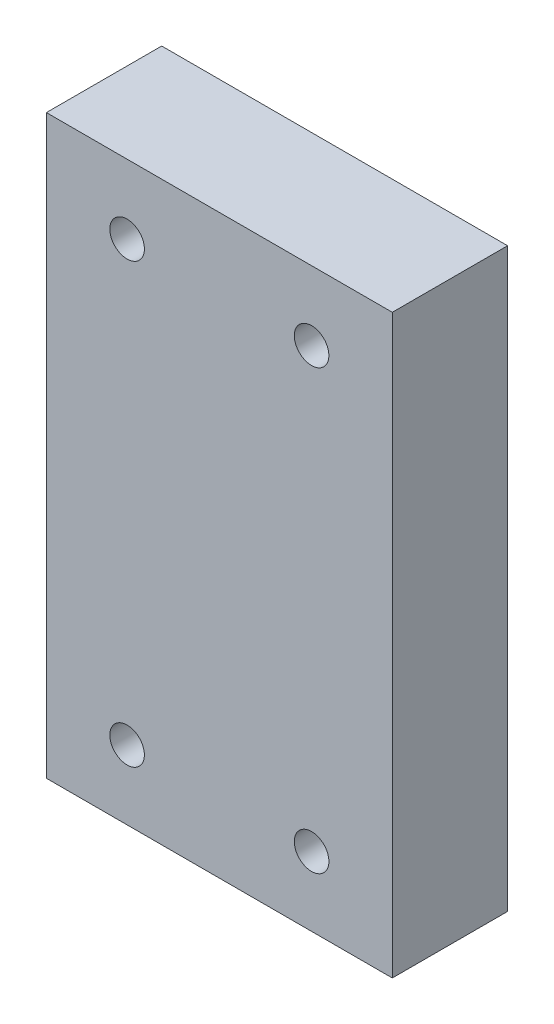
ISO-10303-21;
HEADER;
FILE_DESCRIPTION(('STEP AP214'),'2;1');
FILE_NAME('part.step','',(''),(''),'','','');
FILE_SCHEMA(('AUTOMOTIVE_DESIGN { 1 0 10303 214 1 1 1 1 }'));
ENDSEC;
DATA;
#1=APPLICATION_CONTEXT('core data for automotive mechanical design processes');
#2=APPLICATION_PROTOCOL_DEFINITION('international standard','automotive_design',2000,#1);
#3=PRODUCT_CONTEXT('',#1,'mechanical');
#4=PRODUCT('Part','Part','',(#3));
#5=PRODUCT_RELATED_PRODUCT_CATEGORY('part','',(#4));
#6=PRODUCT_DEFINITION_FORMATION('','',#4);
#7=PRODUCT_DEFINITION_CONTEXT('part definition',#1,'design');
#8=PRODUCT_DEFINITION('design','',#6,#7);
#9=PRODUCT_DEFINITION_SHAPE('','',#8);
#10=(LENGTH_UNIT() NAMED_UNIT(*) SI_UNIT(.MILLI.,.METRE.));
#11=(NAMED_UNIT(*) PLANE_ANGLE_UNIT() SI_UNIT($,.RADIAN.));
#12=(NAMED_UNIT(*) SI_UNIT($,.STERADIAN.) SOLID_ANGLE_UNIT());
#13=UNCERTAINTY_MEASURE_WITH_UNIT(LENGTH_MEASURE(1.E-05),#10,'distance_accuracy_value','');
#14=(GEOMETRIC_REPRESENTATION_CONTEXT(3) GLOBAL_UNCERTAINTY_ASSIGNED_CONTEXT((#13)) GLOBAL_UNIT_ASSIGNED_CONTEXT((#10,
#11,#12)) REPRESENTATION_CONTEXT('',''));
#15=CARTESIAN_POINT('',(0.,0.,0.));
#16=DIRECTION('',(0.,0.,1.));
#17=DIRECTION('',(1.,0.,0.));
#18=AXIS2_PLACEMENT_3D('',#15,#16,#17);
#19=CARTESIAN_POINT('',(0.,0.,10.));
#20=DIRECTION('',(0.,0.,1.));
#21=DIRECTION('',(1.,0.,0.));
#22=AXIS2_PLACEMENT_3D('',#19,#20,#21);
#23=PLANE('',#22);
#24=CARTESIAN_POINT('',(8.,-19.,10.));
#25=DIRECTION('',(0.,0.,1.));
#26=DIRECTION('',(1.,0.,0.));
#27=AXIS2_PLACEMENT_3D('',#24,#25,#26);
#28=CIRCLE('',#27,1.5);
#29=CARTESIAN_POINT('',(9.5,-19.,10.));
#30=VERTEX_POINT('',#29);
#31=EDGE_CURVE('E135',#30,#30,#28,.T.);
#32=ORIENTED_EDGE('',*,*,#31,.F.);
#33=EDGE_LOOP('',(#32));
#34=FACE_BOUND('',#33,.T.);
#35=CARTESIAN_POINT('',(-8.,19.,10.));
#36=DIRECTION('',(0.,0.,1.));
#37=DIRECTION('',(1.,0.,0.));
#38=AXIS2_PLACEMENT_3D('',#35,#36,#37);
#39=CIRCLE('',#38,1.5);
#40=CARTESIAN_POINT('',(-6.5,19.,10.));
#41=VERTEX_POINT('',#40);
#42=EDGE_CURVE('E114',#41,#41,#39,.T.);
#43=ORIENTED_EDGE('',*,*,#42,.F.);
#44=EDGE_LOOP('',(#43));
#45=FACE_BOUND('',#44,.T.);
#46=DIRECTION('',(0.,-1.,0.));
#47=VECTOR('',#46,1.);
#48=CARTESIAN_POINT('',(-15.,-25.,10.));
#49=LINE('',#48,#47);
#50=CARTESIAN_POINT('',(-15.,25.,10.));
#51=VERTEX_POINT('',#50);
#52=CARTESIAN_POINT('',(-15.,-25.,10.));
#53=VERTEX_POINT('',#52);
#54=EDGE_CURVE('E99',#51,#53,#49,.T.);
#55=ORIENTED_EDGE('',*,*,#54,.T.);
#56=DIRECTION('',(1.,0.,0.));
#57=VECTOR('',#56,1.);
#58=CARTESIAN_POINT('',(15.,-25.,10.));
#59=LINE('',#58,#57);
#60=CARTESIAN_POINT('',(15.,-25.,10.));
#61=VERTEX_POINT('',#60);
#62=EDGE_CURVE('E94',#53,#61,#59,.T.);
#63=ORIENTED_EDGE('',*,*,#62,.T.);
#64=DIRECTION('',(0.,1.,0.));
#65=VECTOR('',#64,1.);
#66=CARTESIAN_POINT('',(15.,-25.,10.));
#67=LINE('',#66,#65);
#68=CARTESIAN_POINT('',(15.,25.,10.));
#69=VERTEX_POINT('',#68);
#70=EDGE_CURVE('E97',#61,#69,#67,.T.);
#71=ORIENTED_EDGE('',*,*,#70,.T.);
#72=DIRECTION('',(-1.,0.,0.));
#73=VECTOR('',#72,1.);
#74=CARTESIAN_POINT('',(15.,25.,10.));
#75=LINE('',#74,#73);
#76=EDGE_CURVE('E64',#69,#51,#75,.T.);
#77=ORIENTED_EDGE('',*,*,#76,.T.);
#78=EDGE_LOOP('',(#55,#63,#71,#77));
#79=FACE_BOUND('',#78,.T.);
#80=CARTESIAN_POINT('',(8.,19.,10.));
#81=DIRECTION('',(0.,0.,1.));
#82=DIRECTION('',(-1.,0.,0.));
#83=AXIS2_PLACEMENT_3D('',#80,#81,#82);
#84=CIRCLE('',#83,1.5);
#85=CARTESIAN_POINT('',(6.5,19.,10.));
#86=VERTEX_POINT('',#85);
#87=EDGE_CURVE('E129',#86,#86,#84,.T.);
#88=ORIENTED_EDGE('',*,*,#87,.F.);
#89=EDGE_LOOP('',(#88));
#90=FACE_BOUND('',#89,.T.);
#91=CARTESIAN_POINT('',(-8.,-19.,10.));
#92=DIRECTION('',(0.,0.,1.));
#93=DIRECTION('',(-1.,0.,0.));
#94=AXIS2_PLACEMENT_3D('',#91,#92,#93);
#95=CIRCLE('',#94,1.5);
#96=CARTESIAN_POINT('',(-9.5,-19.,10.));
#97=VERTEX_POINT('',#96);
#98=EDGE_CURVE('E141',#97,#97,#95,.T.);
#99=ORIENTED_EDGE('',*,*,#98,.F.);
#100=EDGE_LOOP('',(#99));
#101=FACE_BOUND('',#100,.T.);
#102=ADVANCED_FACE('F47',(#34,#45,#79,#90,#101),#23,.T.);
#103=CARTESIAN_POINT('',(0.,0.,0.));
#104=DIRECTION('',(0.,0.,1.));
#105=DIRECTION('',(1.,0.,0.));
#106=AXIS2_PLACEMENT_3D('',#103,#104,#105);
#107=PLANE('',#106);
#108=DIRECTION('',(0.,-1.,0.));
#109=VECTOR('',#108,1.);
#110=CARTESIAN_POINT('',(-15.,-25.,0.));
#111=LINE('',#110,#109);
#112=CARTESIAN_POINT('',(-15.,25.,0.));
#113=VERTEX_POINT('',#112);
#114=CARTESIAN_POINT('',(-15.,-25.,0.));
#115=VERTEX_POINT('',#114);
#116=EDGE_CURVE('E111',#113,#115,#111,.T.);
#117=ORIENTED_EDGE('',*,*,#116,.F.);
#118=DIRECTION('',(-1.,0.,0.));
#119=VECTOR('',#118,1.);
#120=CARTESIAN_POINT('',(15.,25.,0.));
#121=LINE('',#120,#119);
#122=CARTESIAN_POINT('',(15.,25.,0.));
#123=VERTEX_POINT('',#122);
#124=EDGE_CURVE('E87',#123,#113,#121,.T.);
#125=ORIENTED_EDGE('',*,*,#124,.F.);
#126=DIRECTION('',(0.,1.,0.));
#127=VECTOR('',#126,1.);
#128=CARTESIAN_POINT('',(15.,-25.,0.));
#129=LINE('',#128,#127);
#130=CARTESIAN_POINT('',(15.,-25.,0.));
#131=VERTEX_POINT('',#130);
#132=EDGE_CURVE('E81',#131,#123,#129,.T.);
#133=ORIENTED_EDGE('',*,*,#132,.F.);
#134=DIRECTION('',(1.,0.,0.));
#135=VECTOR('',#134,1.);
#136=CARTESIAN_POINT('',(15.,-25.,0.));
#137=LINE('',#136,#135);
#138=EDGE_CURVE('E103',#115,#131,#137,.T.);
#139=ORIENTED_EDGE('',*,*,#138,.F.);
#140=EDGE_LOOP('',(#117,#125,#133,#139));
#141=FACE_BOUND('',#140,.T.);
#142=CARTESIAN_POINT('',(-8.,19.,0.));
#143=DIRECTION('',(0.,0.,1.));
#144=DIRECTION('',(1.,0.,0.));
#145=AXIS2_PLACEMENT_3D('',#142,#143,#144);
#146=CIRCLE('',#145,1.5);
#147=CARTESIAN_POINT('',(-6.5,19.,0.));
#148=VERTEX_POINT('',#147);
#149=EDGE_CURVE('E126',#148,#148,#146,.T.);
#150=ORIENTED_EDGE('',*,*,#149,.T.);
#151=EDGE_LOOP('',(#150));
#152=FACE_BOUND('',#151,.T.);
#153=CARTESIAN_POINT('',(8.,19.,0.));
#154=DIRECTION('',(0.,0.,1.));
#155=DIRECTION('',(-1.,0.,0.));
#156=AXIS2_PLACEMENT_3D('',#153,#154,#155);
#157=CIRCLE('',#156,1.5);
#158=CARTESIAN_POINT('',(6.5,19.,0.));
#159=VERTEX_POINT('',#158);
#160=EDGE_CURVE('E132',#159,#159,#157,.T.);
#161=ORIENTED_EDGE('',*,*,#160,.T.);
#162=EDGE_LOOP('',(#161));
#163=FACE_BOUND('',#162,.T.);
#164=CARTESIAN_POINT('',(8.,-19.,0.));
#165=DIRECTION('',(0.,0.,1.));
#166=DIRECTION('',(1.,0.,0.));
#167=AXIS2_PLACEMENT_3D('',#164,#165,#166);
#168=CIRCLE('',#167,1.5);
#169=CARTESIAN_POINT('',(9.5,-19.,0.));
#170=VERTEX_POINT('',#169);
#171=EDGE_CURVE('E138',#170,#170,#168,.T.);
#172=ORIENTED_EDGE('',*,*,#171,.T.);
#173=EDGE_LOOP('',(#172));
#174=FACE_BOUND('',#173,.T.);
#175=CARTESIAN_POINT('',(-8.,-19.,0.));
#176=DIRECTION('',(0.,0.,1.));
#177=DIRECTION('',(-1.,0.,0.));
#178=AXIS2_PLACEMENT_3D('',#175,#176,#177);
#179=CIRCLE('',#178,1.5);
#180=CARTESIAN_POINT('',(-9.5,-19.,0.));
#181=VERTEX_POINT('',#180);
#182=EDGE_CURVE('E144',#181,#181,#179,.T.);
#183=ORIENTED_EDGE('',*,*,#182,.T.);
#184=EDGE_LOOP('',(#183));
#185=FACE_BOUND('',#184,.T.);
#186=ADVANCED_FACE('F122',(#141,#152,#163,#174,#185),#107,.F.);
#187=CARTESIAN_POINT('',(-15.,-25.,10.));
#188=DIRECTION('',(1.,0.,0.));
#189=DIRECTION('',(0.,1.,0.));
#190=AXIS2_PLACEMENT_3D('',#187,#188,#189);
#191=PLANE('',#190);
#192=CARTESIAN_POINT('',(-15.,12.5,5.));
#193=DIRECTION('',(-1.,0.,0.));
#194=DIRECTION('',(0.,-1.,0.));
#195=AXIS2_PLACEMENT_3D('',#192,#193,#194);
#196=CIRCLE('',#195,2.);
#197=CARTESIAN_POINT('',(-15.,10.5,5.));
#198=VERTEX_POINT('',#197);
#199=EDGE_CURVE('E156',#198,#198,#196,.T.);
#200=ORIENTED_EDGE('',*,*,#199,.F.);
#201=EDGE_LOOP('',(#200));
#202=FACE_BOUND('',#201,.T.);
#203=CARTESIAN_POINT('',(-15.,-12.5,5.00000000000001));
#204=DIRECTION('',(-1.,0.,0.));
#205=DIRECTION('',(0.,1.,0.));
#206=AXIS2_PLACEMENT_3D('',#203,#204,#205);
#207=CIRCLE('',#206,2.);
#208=CARTESIAN_POINT('',(-15.,-10.5,5.00000000000001));
#209=VERTEX_POINT('',#208);
#210=EDGE_CURVE('E150',#209,#209,#207,.T.);
#211=ORIENTED_EDGE('',*,*,#210,.F.);
#212=EDGE_LOOP('',(#211));
#213=FACE_BOUND('',#212,.T.);
#214=ORIENTED_EDGE('',*,*,#116,.T.);
#215=DIRECTION('',(0.,0.,-1.));
#216=VECTOR('',#215,1.);
#217=CARTESIAN_POINT('',(-15.,-25.,10.));
#218=LINE('',#217,#216);
#219=EDGE_CURVE('E13',#53,#115,#218,.T.);
#220=ORIENTED_EDGE('',*,*,#219,.F.);
#221=ORIENTED_EDGE('',*,*,#54,.F.);
#222=DIRECTION('',(0.,0.,-1.));
#223=VECTOR('',#222,1.);
#224=CARTESIAN_POINT('',(-15.,25.,10.));
#225=LINE('',#224,#223);
#226=EDGE_CURVE('E107',#51,#113,#225,.T.);
#227=ORIENTED_EDGE('',*,*,#226,.T.);
#228=EDGE_LOOP('',(#214,#220,#221,#227));
#229=FACE_BOUND('',#228,.T.);
#230=ADVANCED_FACE('F49',(#202,#213,#229),#191,.F.);
#231=CARTESIAN_POINT('',(15.,-25.,10.));
#232=DIRECTION('',(0.,1.,0.));
#233=DIRECTION('',(-1.,0.,0.));
#234=AXIS2_PLACEMENT_3D('',#231,#232,#233);
#235=PLANE('',#234);
#236=ORIENTED_EDGE('',*,*,#138,.T.);
#237=DIRECTION('',(0.,0.,-1.));
#238=VECTOR('',#237,1.);
#239=CARTESIAN_POINT('',(15.,-25.,10.));
#240=LINE('',#239,#238);
#241=EDGE_CURVE('E56',#61,#131,#240,.T.);
#242=ORIENTED_EDGE('',*,*,#241,.F.);
#243=ORIENTED_EDGE('',*,*,#62,.F.);
#244=ORIENTED_EDGE('',*,*,#219,.T.);
#245=EDGE_LOOP('',(#236,#242,#243,#244));
#246=FACE_BOUND('',#245,.T.);
#247=ADVANCED_FACE('F102',(#246),#235,.F.);
#248=CARTESIAN_POINT('',(15.,-25.,10.));
#249=DIRECTION('',(-1.,0.,0.));
#250=DIRECTION('',(0.,0.,1.));
#251=AXIS2_PLACEMENT_3D('',#248,#249,#250);
#252=PLANE('',#251);
#253=ORIENTED_EDGE('',*,*,#132,.T.);
#254=DIRECTION('',(0.,0.,-1.));
#255=VECTOR('',#254,1.);
#256=CARTESIAN_POINT('',(15.,25.,10.));
#257=LINE('',#256,#255);
#258=EDGE_CURVE('E104',#69,#123,#257,.T.);
#259=ORIENTED_EDGE('',*,*,#258,.F.);
#260=ORIENTED_EDGE('',*,*,#70,.F.);
#261=ORIENTED_EDGE('',*,*,#241,.T.);
#262=EDGE_LOOP('',(#253,#259,#260,#261));
#263=FACE_BOUND('',#262,.T.);
#264=ADVANCED_FACE('F105',(#263),#252,.F.);
#265=CARTESIAN_POINT('',(15.,25.,10.));
#266=DIRECTION('',(0.,-1.,0.));
#267=DIRECTION('',(1.,0.,0.));
#268=AXIS2_PLACEMENT_3D('',#265,#266,#267);
#269=PLANE('',#268);
#270=ORIENTED_EDGE('',*,*,#124,.T.);
#271=ORIENTED_EDGE('',*,*,#226,.F.);
#272=ORIENTED_EDGE('',*,*,#76,.F.);
#273=ORIENTED_EDGE('',*,*,#258,.T.);
#274=EDGE_LOOP('',(#270,#271,#272,#273));
#275=FACE_BOUND('',#274,.T.);
#276=ADVANCED_FACE('F119',(#275),#269,.F.);
#277=CARTESIAN_POINT('',(-8.,19.,10.));
#278=DIRECTION('',(0.,0.,-1.));
#279=DIRECTION('',(-1.,0.,0.));
#280=AXIS2_PLACEMENT_3D('',#277,#278,#279);
#281=CYLINDRICAL_SURFACE('',#280,1.5);
#282=ORIENTED_EDGE('',*,*,#42,.T.);
#283=EDGE_LOOP('',(#282));
#284=FACE_BOUND('',#283,.T.);
#285=ORIENTED_EDGE('',*,*,#149,.F.);
#286=EDGE_LOOP('',(#285));
#287=FACE_BOUND('',#286,.T.);
#288=ADVANCED_FACE('F200',(#284,#287),#281,.F.);
#289=CARTESIAN_POINT('',(8.,19.,10.));
#290=DIRECTION('',(0.,0.,-1.));
#291=DIRECTION('',(-1.,0.,0.));
#292=AXIS2_PLACEMENT_3D('',#289,#290,#291);
#293=CYLINDRICAL_SURFACE('',#292,1.5);
#294=ORIENTED_EDGE('',*,*,#87,.T.);
#295=EDGE_LOOP('',(#294));
#296=FACE_BOUND('',#295,.T.);
#297=ORIENTED_EDGE('',*,*,#160,.F.);
#298=EDGE_LOOP('',(#297));
#299=FACE_BOUND('',#298,.T.);
#300=ADVANCED_FACE('F226',(#296,#299),#293,.F.);
#301=CARTESIAN_POINT('',(8.,-19.,10.));
#302=DIRECTION('',(0.,0.,-1.));
#303=DIRECTION('',(-1.,0.,0.));
#304=AXIS2_PLACEMENT_3D('',#301,#302,#303);
#305=CYLINDRICAL_SURFACE('',#304,1.5);
#306=ORIENTED_EDGE('',*,*,#31,.T.);
#307=EDGE_LOOP('',(#306));
#308=FACE_BOUND('',#307,.T.);
#309=ORIENTED_EDGE('',*,*,#171,.F.);
#310=EDGE_LOOP('',(#309));
#311=FACE_BOUND('',#310,.T.);
#312=ADVANCED_FACE('F186',(#308,#311),#305,.F.);
#313=CARTESIAN_POINT('',(-8.,-19.,10.));
#314=DIRECTION('',(0.,0.,-1.));
#315=DIRECTION('',(-1.,0.,0.));
#316=AXIS2_PLACEMENT_3D('',#313,#314,#315);
#317=CYLINDRICAL_SURFACE('',#316,1.5);
#318=ORIENTED_EDGE('',*,*,#98,.T.);
#319=EDGE_LOOP('',(#318));
#320=FACE_BOUND('',#319,.T.);
#321=ORIENTED_EDGE('',*,*,#182,.F.);
#322=EDGE_LOOP('',(#321));
#323=FACE_BOUND('',#322,.T.);
#324=ADVANCED_FACE('F177',(#320,#323),#317,.F.);
#325=CARTESIAN_POINT('',(-5.,-12.5,5.00000000000001));
#326=DIRECTION('',(-1.,0.,0.));
#327=DIRECTION('',(0.,-1.,0.));
#328=AXIS2_PLACEMENT_3D('',#325,#326,#327);
#329=CYLINDRICAL_SURFACE('',#328,2.);
#330=CARTESIAN_POINT('',(-5.,-12.5,5.00000000000001));
#331=DIRECTION('',(-1.,0.,0.));
#332=DIRECTION('',(0.,1.,0.));
#333=AXIS2_PLACEMENT_3D('',#330,#331,#332);
#334=CIRCLE('',#333,2.);
#335=CARTESIAN_POINT('',(-5.,-10.5,5.00000000000001));
#336=VERTEX_POINT('',#335);
#337=EDGE_CURVE('E153',#336,#336,#334,.T.);
#338=ORIENTED_EDGE('',*,*,#337,.F.);
#339=EDGE_LOOP('',(#338));
#340=FACE_BOUND('',#339,.T.);
#341=ORIENTED_EDGE('',*,*,#210,.T.);
#342=EDGE_LOOP('',(#341));
#343=FACE_BOUND('',#342,.T.);
#344=ADVANCED_FACE('F175',(#340,#343),#329,.F.);
#345=CARTESIAN_POINT('',(-5.,-12.5,5.00000000000001));
#346=DIRECTION('',(1.,0.,0.));
#347=DIRECTION('',(0.,1.,0.));
#348=AXIS2_PLACEMENT_3D('',#345,#346,#347);
#349=PLANE('',#348);
#350=ORIENTED_EDGE('',*,*,#337,.T.);
#351=EDGE_LOOP('',(#350));
#352=FACE_BOUND('',#351,.T.);
#353=ADVANCED_FACE('F167',(#352),#349,.F.);
#354=CARTESIAN_POINT('',(-5.,12.5,5.));
#355=DIRECTION('',(-1.,0.,0.));
#356=DIRECTION('',(0.,-1.,0.));
#357=AXIS2_PLACEMENT_3D('',#354,#355,#356);
#358=CYLINDRICAL_SURFACE('',#357,2.);
#359=CARTESIAN_POINT('',(-5.,12.5,5.));
#360=DIRECTION('',(-1.,0.,0.));
#361=DIRECTION('',(0.,-1.,0.));
#362=AXIS2_PLACEMENT_3D('',#359,#360,#361);
#363=CIRCLE('',#362,2.);
#364=CARTESIAN_POINT('',(-5.,10.5,5.));
#365=VERTEX_POINT('',#364);
#366=EDGE_CURVE('E147',#365,#365,#363,.T.);
#367=ORIENTED_EDGE('',*,*,#366,.F.);
#368=EDGE_LOOP('',(#367));
#369=FACE_BOUND('',#368,.T.);
#370=ORIENTED_EDGE('',*,*,#199,.T.);
#371=EDGE_LOOP('',(#370));
#372=FACE_BOUND('',#371,.T.);
#373=ADVANCED_FACE('F164',(#369,#372),#358,.F.);
#374=CARTESIAN_POINT('',(-5.,12.5,5.));
#375=DIRECTION('',(-1.,0.,0.));
#376=DIRECTION('',(0.,-1.,0.));
#377=AXIS2_PLACEMENT_3D('',#374,#375,#376);
#378=PLANE('',#377);
#379=ORIENTED_EDGE('',*,*,#366,.T.);
#380=EDGE_LOOP('',(#379));
#381=FACE_BOUND('',#380,.T.);
#382=ADVANCED_FACE('F162',(#381),#378,.T.);
#383=CLOSED_SHELL('',(#102,#186,#230,#247,#264,#276,#288,#300,#312,#324,#344,#353,#373,#382));
#384=MANIFOLD_SOLID_BREP('B2',#383);
#385=ADVANCED_BREP_SHAPE_REPRESENTATION('',(#18,#384),#14);
#386=SHAPE_DEFINITION_REPRESENTATION(#9,#385);
ENDSEC;
END-ISO-10303-21;
